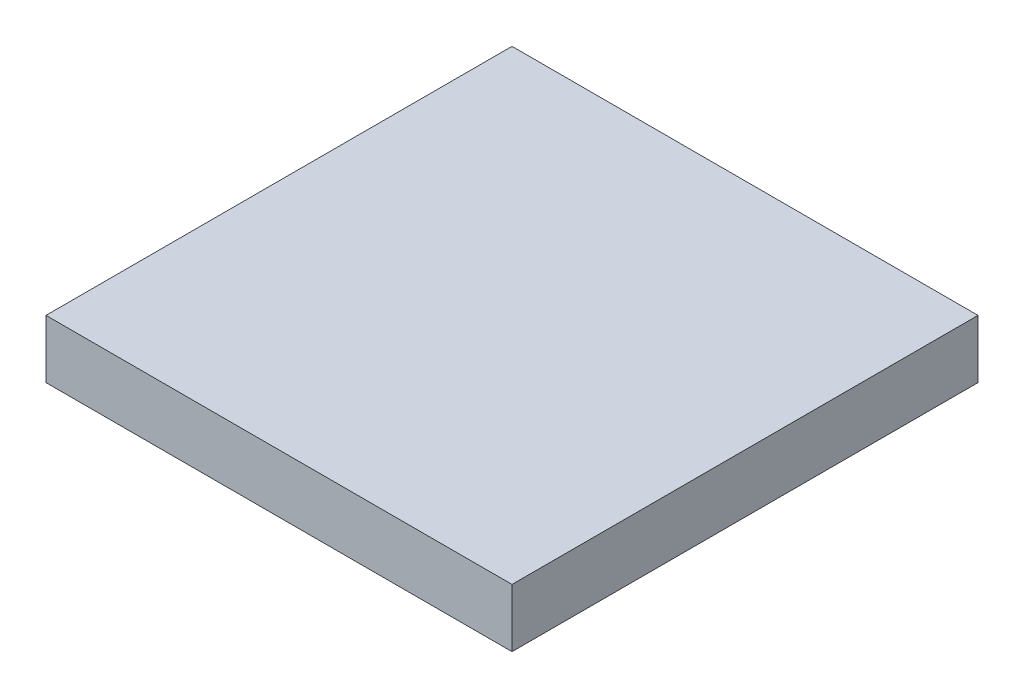
ISO-10303-21;
HEADER;
FILE_DESCRIPTION(('STEP AP214'),'2;1');
FILE_NAME('part.step','',(''),(''),'','','');
FILE_SCHEMA(('AUTOMOTIVE_DESIGN { 1 0 10303 214 1 1 1 1 }'));
ENDSEC;
DATA;
#1=APPLICATION_CONTEXT('core data for automotive mechanical design processes');
#2=APPLICATION_PROTOCOL_DEFINITION('international standard','automotive_design',2000,#1);
#3=PRODUCT_CONTEXT('',#1,'mechanical');
#4=PRODUCT('Part','Part','',(#3));
#5=PRODUCT_RELATED_PRODUCT_CATEGORY('part','',(#4));
#6=PRODUCT_DEFINITION_FORMATION('','',#4);
#7=PRODUCT_DEFINITION_CONTEXT('part definition',#1,'design');
#8=PRODUCT_DEFINITION('design','',#6,#7);
#9=PRODUCT_DEFINITION_SHAPE('','',#8);
#10=(LENGTH_UNIT() NAMED_UNIT(*) SI_UNIT(.MILLI.,.METRE.));
#11=(NAMED_UNIT(*) PLANE_ANGLE_UNIT() SI_UNIT($,.RADIAN.));
#12=(NAMED_UNIT(*) SI_UNIT($,.STERADIAN.) SOLID_ANGLE_UNIT());
#13=UNCERTAINTY_MEASURE_WITH_UNIT(LENGTH_MEASURE(1.E-05),#10,'distance_accuracy_value','');
#14=(GEOMETRIC_REPRESENTATION_CONTEXT(3) GLOBAL_UNCERTAINTY_ASSIGNED_CONTEXT((#13)) GLOBAL_UNIT_ASSIGNED_CONTEXT((#10,
#11,#12)) REPRESENTATION_CONTEXT('',''));
#15=CARTESIAN_POINT('',(0.,0.,0.));
#16=DIRECTION('',(0.,0.,1.));
#17=DIRECTION('',(1.,0.,0.));
#18=AXIS2_PLACEMENT_3D('',#15,#16,#17);
#19=CARTESIAN_POINT('',(-12.7,1.5875,-12.7));
#20=DIRECTION('',(-1.,0.,0.));
#21=DIRECTION('',(0.,0.,1.));
#22=AXIS2_PLACEMENT_3D('',#19,#20,#21);
#23=PLANE('',#22);
#24=DIRECTION('',(0.,0.,1.));
#25=VECTOR('',#24,1.);
#26=CARTESIAN_POINT('',(-12.7,-1.5875,-12.7));
#27=LINE('',#26,#25);
#28=CARTESIAN_POINT('',(-12.7,-1.5875,-12.7));
#29=VERTEX_POINT('',#28);
#30=CARTESIAN_POINT('',(-12.7,-1.5875,12.7));
#31=VERTEX_POINT('',#30);
#32=EDGE_CURVE('E46',#29,#31,#27,.T.);
#33=ORIENTED_EDGE('',*,*,#32,.T.);
#34=DIRECTION('',(0.,-1.,0.));
#35=VECTOR('',#34,1.);
#36=CARTESIAN_POINT('',(-12.7,1.5875,12.7));
#37=LINE('',#36,#35);
#38=CARTESIAN_POINT('',(-12.7,1.5875,12.7));
#39=VERTEX_POINT('',#38);
#40=EDGE_CURVE('E84',#39,#31,#37,.T.);
#41=ORIENTED_EDGE('',*,*,#40,.F.);
#42=DIRECTION('',(0.,0.,1.));
#43=VECTOR('',#42,1.);
#44=CARTESIAN_POINT('',(-12.7,1.5875,-12.7));
#45=LINE('',#44,#43);
#46=CARTESIAN_POINT('',(-12.7,1.5875,-12.7));
#47=VERTEX_POINT('',#46);
#48=EDGE_CURVE('E11',#47,#39,#45,.T.);
#49=ORIENTED_EDGE('',*,*,#48,.F.);
#50=DIRECTION('',(0.,-1.,0.));
#51=VECTOR('',#50,1.);
#52=CARTESIAN_POINT('',(-12.7,1.5875,-12.7));
#53=LINE('',#52,#51);
#54=EDGE_CURVE('E85',#47,#29,#53,.T.);
#55=ORIENTED_EDGE('',*,*,#54,.T.);
#56=EDGE_LOOP('',(#33,#41,#49,#55));
#57=FACE_BOUND('',#56,.T.);
#58=ADVANCED_FACE('F43',(#57),#23,.T.);
#59=CARTESIAN_POINT('',(-12.7,1.5875,-12.7));
#60=DIRECTION('',(0.,1.,0.));
#61=DIRECTION('',(0.,0.,1.));
#62=AXIS2_PLACEMENT_3D('',#59,#60,#61);
#63=PLANE('',#62);
#64=ORIENTED_EDGE('',*,*,#48,.T.);
#65=DIRECTION('',(-1.,0.,0.));
#66=VECTOR('',#65,1.);
#67=CARTESIAN_POINT('',(-12.7,1.5875,12.7));
#68=LINE('',#67,#66);
#69=CARTESIAN_POINT('',(12.7,1.5875,12.7));
#70=VERTEX_POINT('',#69);
#71=EDGE_CURVE('E103',#70,#39,#68,.T.);
#72=ORIENTED_EDGE('',*,*,#71,.F.);
#73=DIRECTION('',(0.,0.,1.));
#74=VECTOR('',#73,1.);
#75=CARTESIAN_POINT('',(12.7,1.5875,-12.7));
#76=LINE('',#75,#74);
#77=CARTESIAN_POINT('',(12.7,1.5875,-12.7));
#78=VERTEX_POINT('',#77);
#79=EDGE_CURVE('E52',#78,#70,#76,.T.);
#80=ORIENTED_EDGE('',*,*,#79,.F.);
#81=DIRECTION('',(-1.,0.,0.));
#82=VECTOR('',#81,1.);
#83=CARTESIAN_POINT('',(-12.7,1.5875,-12.7));
#84=LINE('',#83,#82);
#85=EDGE_CURVE('E91',#78,#47,#84,.T.);
#86=ORIENTED_EDGE('',*,*,#85,.T.);
#87=EDGE_LOOP('',(#64,#72,#80,#86));
#88=FACE_BOUND('',#87,.T.);
#89=ADVANCED_FACE('F127',(#88),#63,.T.);
#90=CARTESIAN_POINT('',(12.7,1.5875,-12.7));
#91=DIRECTION('',(1.,0.,0.));
#92=DIRECTION('',(0.,0.,-1.));
#93=AXIS2_PLACEMENT_3D('',#90,#91,#92);
#94=PLANE('',#93);
#95=ORIENTED_EDGE('',*,*,#79,.T.);
#96=DIRECTION('',(0.,1.,0.));
#97=VECTOR('',#96,1.);
#98=CARTESIAN_POINT('',(12.7,1.5875,12.7));
#99=LINE('',#98,#97);
#100=CARTESIAN_POINT('',(12.7,-1.5875,12.7));
#101=VERTEX_POINT('',#100);
#102=EDGE_CURVE('E99',#101,#70,#99,.T.);
#103=ORIENTED_EDGE('',*,*,#102,.F.);
#104=DIRECTION('',(0.,0.,1.));
#105=VECTOR('',#104,1.);
#106=CARTESIAN_POINT('',(12.7,-1.5875,-12.7));
#107=LINE('',#106,#105);
#108=CARTESIAN_POINT('',(12.7,-1.5875,-12.7));
#109=VERTEX_POINT('',#108);
#110=EDGE_CURVE('E90',#109,#101,#107,.T.);
#111=ORIENTED_EDGE('',*,*,#110,.F.);
#112=DIRECTION('',(0.,1.,0.));
#113=VECTOR('',#112,1.);
#114=CARTESIAN_POINT('',(12.7,1.5875,-12.7));
#115=LINE('',#114,#113);
#116=EDGE_CURVE('E116',#109,#78,#115,.T.);
#117=ORIENTED_EDGE('',*,*,#116,.T.);
#118=EDGE_LOOP('',(#95,#103,#111,#117));
#119=FACE_BOUND('',#118,.T.);
#120=ADVANCED_FACE('F124',(#119),#94,.T.);
#121=CARTESIAN_POINT('',(-12.7,-1.5875,-12.7));
#122=DIRECTION('',(0.,-1.,0.));
#123=DIRECTION('',(0.,0.,-1.));
#124=AXIS2_PLACEMENT_3D('',#121,#122,#123);
#125=PLANE('',#124);
#126=ORIENTED_EDGE('',*,*,#110,.T.);
#127=DIRECTION('',(1.,0.,0.));
#128=VECTOR('',#127,1.);
#129=CARTESIAN_POINT('',(-12.7,-1.5875,12.7));
#130=LINE('',#129,#128);
#131=EDGE_CURVE('E93',#31,#101,#130,.T.);
#132=ORIENTED_EDGE('',*,*,#131,.F.);
#133=ORIENTED_EDGE('',*,*,#32,.F.);
#134=DIRECTION('',(1.,0.,0.));
#135=VECTOR('',#134,1.);
#136=CARTESIAN_POINT('',(-12.7,-1.5875,-12.7));
#137=LINE('',#136,#135);
#138=EDGE_CURVE('E113',#29,#109,#137,.T.);
#139=ORIENTED_EDGE('',*,*,#138,.T.);
#140=EDGE_LOOP('',(#126,#132,#133,#139));
#141=FACE_BOUND('',#140,.T.);
#142=ADVANCED_FACE('F94',(#141),#125,.T.);
#143=CARTESIAN_POINT('',(0.,0.,-12.7));
#144=DIRECTION('',(0.,0.,1.));
#145=DIRECTION('',(1.,0.,0.));
#146=AXIS2_PLACEMENT_3D('',#143,#144,#145);
#147=PLANE('',#146);
#148=ORIENTED_EDGE('',*,*,#54,.F.);
#149=ORIENTED_EDGE('',*,*,#85,.F.);
#150=ORIENTED_EDGE('',*,*,#116,.F.);
#151=ORIENTED_EDGE('',*,*,#138,.F.);
#152=EDGE_LOOP('',(#148,#149,#150,#151));
#153=FACE_BOUND('',#152,.T.);
#154=ADVANCED_FACE('F129',(#153),#147,.F.);
#155=CARTESIAN_POINT('',(0.,0.,12.7));
#156=DIRECTION('',(0.,0.,1.));
#157=DIRECTION('',(1.,0.,0.));
#158=AXIS2_PLACEMENT_3D('',#155,#156,#157);
#159=PLANE('',#158);
#160=ORIENTED_EDGE('',*,*,#40,.T.);
#161=ORIENTED_EDGE('',*,*,#131,.T.);
#162=ORIENTED_EDGE('',*,*,#102,.T.);
#163=ORIENTED_EDGE('',*,*,#71,.T.);
#164=EDGE_LOOP('',(#160,#161,#162,#163));
#165=FACE_BOUND('',#164,.T.);
#166=ADVANCED_FACE('F102',(#165),#159,.T.);
#167=CLOSED_SHELL('',(#58,#89,#120,#142,#154,#166));
#168=MANIFOLD_SOLID_BREP('B2',#167);
#169=ADVANCED_BREP_SHAPE_REPRESENTATION('',(#18,#168),#14);
#170=SHAPE_DEFINITION_REPRESENTATION(#9,#169);
ENDSEC;
END-ISO-10303-21;
